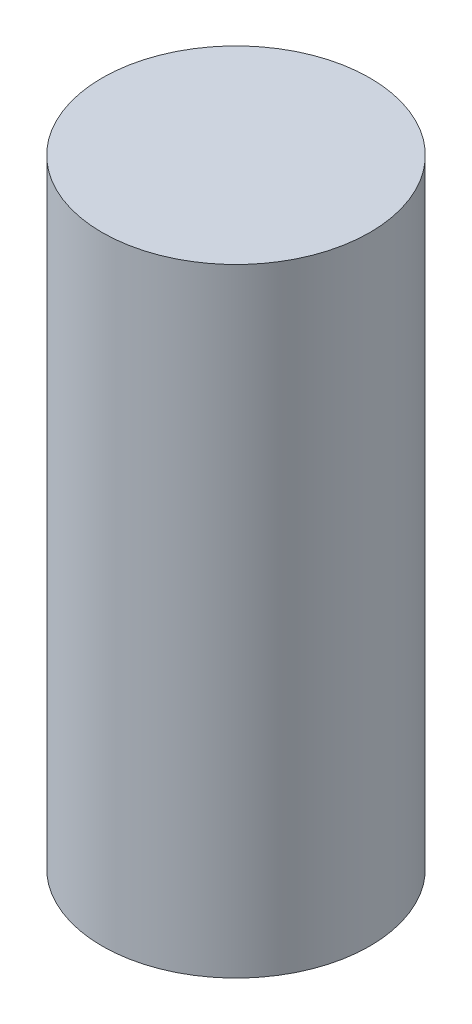
ISO-10303-21;
HEADER;
FILE_DESCRIPTION(('STEP AP214'),'2;1');
FILE_NAME('part.step','',(''),(''),'','','');
FILE_SCHEMA(('AUTOMOTIVE_DESIGN { 1 0 10303 214 1 1 1 1 }'));
ENDSEC;
DATA;
#1=APPLICATION_CONTEXT('core data for automotive mechanical design processes');
#2=APPLICATION_PROTOCOL_DEFINITION('international standard','automotive_design',2000,#1);
#3=PRODUCT_CONTEXT('',#1,'mechanical');
#4=PRODUCT('Part','Part','',(#3));
#5=PRODUCT_RELATED_PRODUCT_CATEGORY('part','',(#4));
#6=PRODUCT_DEFINITION_FORMATION('','',#4);
#7=PRODUCT_DEFINITION_CONTEXT('part definition',#1,'design');
#8=PRODUCT_DEFINITION('design','',#6,#7);
#9=PRODUCT_DEFINITION_SHAPE('','',#8);
#10=(LENGTH_UNIT() NAMED_UNIT(*) SI_UNIT(.MILLI.,.METRE.));
#11=(NAMED_UNIT(*) PLANE_ANGLE_UNIT() SI_UNIT($,.RADIAN.));
#12=(NAMED_UNIT(*) SI_UNIT($,.STERADIAN.) SOLID_ANGLE_UNIT());
#13=UNCERTAINTY_MEASURE_WITH_UNIT(LENGTH_MEASURE(1.E-05),#10,'distance_accuracy_value','');
#14=(GEOMETRIC_REPRESENTATION_CONTEXT(3) GLOBAL_UNCERTAINTY_ASSIGNED_CONTEXT((#13)) GLOBAL_UNIT_ASSIGNED_CONTEXT((#10,
#11,#12)) REPRESENTATION_CONTEXT('',''));
#15=CARTESIAN_POINT('',(0.,0.,0.));
#16=DIRECTION('',(0.,0.,1.));
#17=DIRECTION('',(1.,0.,0.));
#18=AXIS2_PLACEMENT_3D('',#15,#16,#17);
#19=CARTESIAN_POINT('',(0.,150.,0.));
#20=DIRECTION('',(0.,-1.,0.));
#21=DIRECTION('',(0.,0.,-1.));
#22=AXIS2_PLACEMENT_3D('',#19,#20,#21);
#23=CYLINDRICAL_SURFACE('',#22,32.5);
#24=CARTESIAN_POINT('',(0.,150.,0.));
#25=DIRECTION('',(0.,1.,0.));
#26=DIRECTION('',(0.,0.,1.));
#27=AXIS2_PLACEMENT_3D('',#24,#25,#26);
#28=CIRCLE('',#27,32.5);
#29=CARTESIAN_POINT('',(0.,150.,32.5));
#30=VERTEX_POINT('',#29);
#31=EDGE_CURVE('E10',#30,#30,#28,.T.);
#32=ORIENTED_EDGE('',*,*,#31,.F.);
#33=EDGE_LOOP('',(#32));
#34=FACE_BOUND('',#33,.T.);
#35=CARTESIAN_POINT('',(0.,0.,0.));
#36=DIRECTION('',(0.,1.,0.));
#37=DIRECTION('',(0.,0.,1.));
#38=AXIS2_PLACEMENT_3D('',#35,#36,#37);
#39=CIRCLE('',#38,32.5);
#40=CARTESIAN_POINT('',(0.,0.,32.5));
#41=VERTEX_POINT('',#40);
#42=EDGE_CURVE('E50',#41,#41,#39,.T.);
#43=ORIENTED_EDGE('',*,*,#42,.T.);
#44=EDGE_LOOP('',(#43));
#45=FACE_BOUND('',#44,.T.);
#46=ADVANCED_FACE('F47',(#34,#45),#23,.T.);
#47=CARTESIAN_POINT('',(0.,150.,0.));
#48=DIRECTION('',(0.,1.,0.));
#49=DIRECTION('',(0.,0.,1.));
#50=AXIS2_PLACEMENT_3D('',#47,#48,#49);
#51=PLANE('',#50);
#52=ORIENTED_EDGE('',*,*,#31,.T.);
#53=EDGE_LOOP('',(#52));
#54=FACE_BOUND('',#53,.T.);
#55=ADVANCED_FACE('F64',(#54),#51,.T.);
#56=CARTESIAN_POINT('',(0.,0.,0.));
#57=DIRECTION('',(0.,1.,0.));
#58=DIRECTION('',(0.,0.,1.));
#59=AXIS2_PLACEMENT_3D('',#56,#57,#58);
#60=PLANE('',#59);
#61=ORIENTED_EDGE('',*,*,#42,.F.);
#62=EDGE_LOOP('',(#61));
#63=FACE_BOUND('',#62,.T.);
#64=ADVANCED_FACE('F62',(#63),#60,.F.);
#65=CLOSED_SHELL('',(#46,#55,#64));
#66=MANIFOLD_SOLID_BREP('B2',#65);
#67=ADVANCED_BREP_SHAPE_REPRESENTATION('',(#18,#66),#14);
#68=SHAPE_DEFINITION_REPRESENTATION(#9,#67);
ENDSEC;
END-ISO-10303-21;
